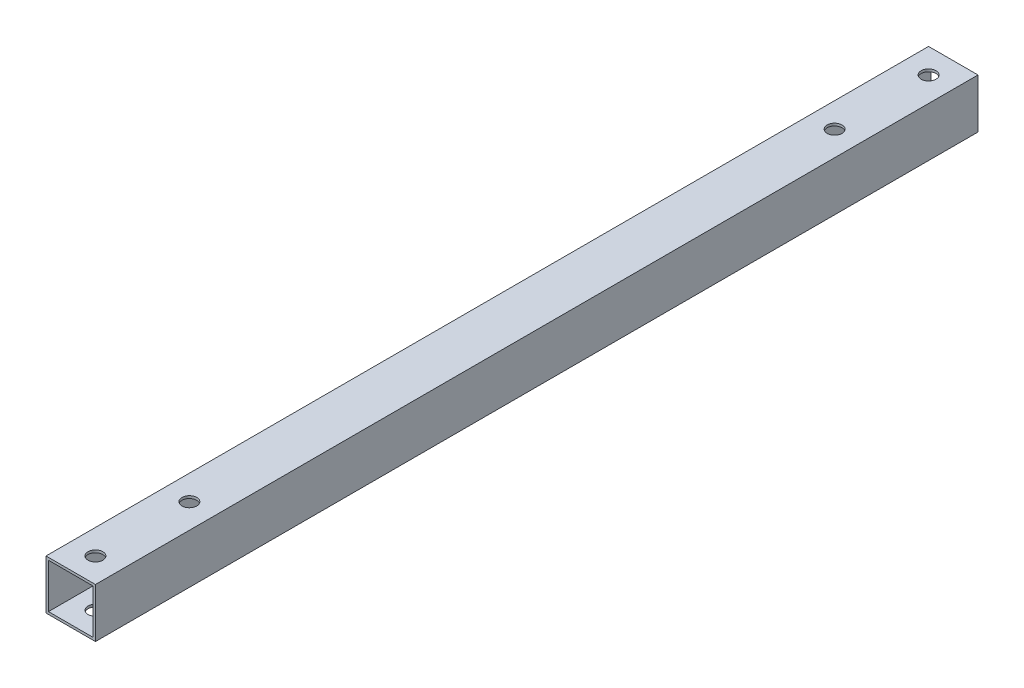
ISO-10303-21;
HEADER;
FILE_DESCRIPTION(('STEP AP214'),'2;1');
FILE_NAME('part.step','',(''),(''),'','','');
FILE_SCHEMA(('AUTOMOTIVE_DESIGN { 1 0 10303 214 1 1 1 1 }'));
ENDSEC;
DATA;
#1=APPLICATION_CONTEXT('core data for automotive mechanical design processes');
#2=APPLICATION_PROTOCOL_DEFINITION('international standard','automotive_design',2000,#1);
#3=PRODUCT_CONTEXT('',#1,'mechanical');
#4=PRODUCT('Part','Part','',(#3));
#5=PRODUCT_RELATED_PRODUCT_CATEGORY('part','',(#4));
#6=PRODUCT_DEFINITION_FORMATION('','',#4);
#7=PRODUCT_DEFINITION_CONTEXT('part definition',#1,'design');
#8=PRODUCT_DEFINITION('design','',#6,#7);
#9=PRODUCT_DEFINITION_SHAPE('','',#8);
#10=(LENGTH_UNIT() NAMED_UNIT(*) SI_UNIT(.MILLI.,.METRE.));
#11=(NAMED_UNIT(*) PLANE_ANGLE_UNIT() SI_UNIT($,.RADIAN.));
#12=(NAMED_UNIT(*) SI_UNIT($,.STERADIAN.) SOLID_ANGLE_UNIT());
#13=UNCERTAINTY_MEASURE_WITH_UNIT(LENGTH_MEASURE(1.E-05),#10,'distance_accuracy_value','');
#14=(GEOMETRIC_REPRESENTATION_CONTEXT(3) GLOBAL_UNCERTAINTY_ASSIGNED_CONTEXT((#13)) GLOBAL_UNIT_ASSIGNED_CONTEXT((#10,
#11,#12)) REPRESENTATION_CONTEXT('',''));
#15=CARTESIAN_POINT('',(0.,0.,0.));
#16=DIRECTION('',(0.,0.,1.));
#17=DIRECTION('',(1.,0.,0.));
#18=AXIS2_PLACEMENT_3D('',#15,#16,#17);
#19=CARTESIAN_POINT('',(5.,-5.,178.5));
#20=DIRECTION('',(0.,0.,1.));
#21=DIRECTION('',(1.,0.,0.));
#22=AXIS2_PLACEMENT_3D('',#19,#20,#21);
#23=PLANE('',#22);
#24=DIRECTION('',(0.,1.,0.));
#25=VECTOR('',#24,1.);
#26=CARTESIAN_POINT('',(5.,5.,178.5));
#27=LINE('',#26,#25);
#28=CARTESIAN_POINT('',(5.,-5.,178.5));
#29=VERTEX_POINT('',#28);
#30=CARTESIAN_POINT('',(5.,5.,178.5));
#31=VERTEX_POINT('',#30);
#32=EDGE_CURVE('E137',#29,#31,#27,.T.);
#33=ORIENTED_EDGE('',*,*,#32,.T.);
#34=DIRECTION('',(-1.,0.,0.));
#35=VECTOR('',#34,1.);
#36=CARTESIAN_POINT('',(-5.,5.,178.5));
#37=LINE('',#36,#35);
#38=CARTESIAN_POINT('',(-5.,5.,178.5));
#39=VERTEX_POINT('',#38);
#40=EDGE_CURVE('E140',#31,#39,#37,.T.);
#41=ORIENTED_EDGE('',*,*,#40,.T.);
#42=DIRECTION('',(0.,-1.,0.));
#43=VECTOR('',#42,1.);
#44=CARTESIAN_POINT('',(-5.,5.,178.5));
#45=LINE('',#44,#43);
#46=CARTESIAN_POINT('',(-5.,-5.,178.5));
#47=VERTEX_POINT('',#46);
#48=EDGE_CURVE('E143',#39,#47,#45,.T.);
#49=ORIENTED_EDGE('',*,*,#48,.T.);
#50=DIRECTION('',(1.,0.,0.));
#51=VECTOR('',#50,1.);
#52=CARTESIAN_POINT('',(-5.,-5.,178.5));
#53=LINE('',#52,#51);
#54=EDGE_CURVE('E145',#47,#29,#53,.T.);
#55=ORIENTED_EDGE('',*,*,#54,.T.);
#56=EDGE_LOOP('',(#33,#41,#49,#55));
#57=FACE_BOUND('',#56,.T.);
#58=DIRECTION('',(-1.,0.,0.));
#59=VECTOR('',#58,1.);
#60=CARTESIAN_POINT('',(-4.5,4.5,178.5));
#61=LINE('',#60,#59);
#62=CARTESIAN_POINT('',(4.5,4.5,178.5));
#63=VERTEX_POINT('',#62);
#64=CARTESIAN_POINT('',(-4.5,4.5,178.5));
#65=VERTEX_POINT('',#64);
#66=EDGE_CURVE('E107',#63,#65,#61,.T.);
#67=ORIENTED_EDGE('',*,*,#66,.F.);
#68=DIRECTION('',(0.,1.,0.));
#69=VECTOR('',#68,1.);
#70=CARTESIAN_POINT('',(4.5,4.5,178.5));
#71=LINE('',#70,#69);
#72=CARTESIAN_POINT('',(4.5,-4.5,178.5));
#73=VERTEX_POINT('',#72);
#74=EDGE_CURVE('E99',#73,#63,#71,.T.);
#75=ORIENTED_EDGE('',*,*,#74,.F.);
#76=DIRECTION('',(1.,0.,0.));
#77=VECTOR('',#76,1.);
#78=CARTESIAN_POINT('',(-4.5,-4.5,178.5));
#79=LINE('',#78,#77);
#80=CARTESIAN_POINT('',(-4.5,-4.5,178.5));
#81=VERTEX_POINT('',#80);
#82=EDGE_CURVE('E121',#81,#73,#79,.T.);
#83=ORIENTED_EDGE('',*,*,#82,.F.);
#84=DIRECTION('',(0.,-1.,0.));
#85=VECTOR('',#84,1.);
#86=CARTESIAN_POINT('',(-4.5,4.5,178.5));
#87=LINE('',#86,#85);
#88=EDGE_CURVE('E119',#65,#81,#87,.T.);
#89=ORIENTED_EDGE('',*,*,#88,.F.);
#90=EDGE_LOOP('',(#67,#75,#83,#89));
#91=FACE_BOUND('',#90,.T.);
#92=ADVANCED_FACE('F32',(#57,#91),#23,.T.);
#93=CARTESIAN_POINT('',(5.,-5.,0.));
#94=DIRECTION('',(0.,0.,1.));
#95=DIRECTION('',(1.,0.,0.));
#96=AXIS2_PLACEMENT_3D('',#93,#94,#95);
#97=PLANE('',#96);
#98=DIRECTION('',(0.,1.,0.));
#99=VECTOR('',#98,1.);
#100=CARTESIAN_POINT('',(5.,5.,0.));
#101=LINE('',#100,#99);
#102=CARTESIAN_POINT('',(5.,-5.,0.));
#103=VERTEX_POINT('',#102);
#104=CARTESIAN_POINT('',(5.,5.,0.));
#105=VERTEX_POINT('',#104);
#106=EDGE_CURVE('E115',#103,#105,#101,.T.);
#107=ORIENTED_EDGE('',*,*,#106,.F.);
#108=DIRECTION('',(1.,0.,0.));
#109=VECTOR('',#108,1.);
#110=CARTESIAN_POINT('',(-5.,-5.,0.));
#111=LINE('',#110,#109);
#112=CARTESIAN_POINT('',(-5.,-5.,0.));
#113=VERTEX_POINT('',#112);
#114=EDGE_CURVE('E141',#113,#103,#111,.T.);
#115=ORIENTED_EDGE('',*,*,#114,.F.);
#116=DIRECTION('',(0.,-1.,0.));
#117=VECTOR('',#116,1.);
#118=CARTESIAN_POINT('',(-5.,5.,0.));
#119=LINE('',#118,#117);
#120=CARTESIAN_POINT('',(-5.,5.,0.));
#121=VERTEX_POINT('',#120);
#122=EDGE_CURVE('E152',#121,#113,#119,.T.);
#123=ORIENTED_EDGE('',*,*,#122,.F.);
#124=DIRECTION('',(-1.,0.,0.));
#125=VECTOR('',#124,1.);
#126=CARTESIAN_POINT('',(-5.,5.,0.));
#127=LINE('',#126,#125);
#128=EDGE_CURVE('E150',#105,#121,#127,.T.);
#129=ORIENTED_EDGE('',*,*,#128,.F.);
#130=EDGE_LOOP('',(#107,#115,#123,#129));
#131=FACE_BOUND('',#130,.T.);
#132=DIRECTION('',(0.,1.,0.));
#133=VECTOR('',#132,1.);
#134=CARTESIAN_POINT('',(4.5,4.5,0.));
#135=LINE('',#134,#133);
#136=CARTESIAN_POINT('',(4.5,-4.5,0.));
#137=VERTEX_POINT('',#136);
#138=CARTESIAN_POINT('',(4.5,4.5,0.));
#139=VERTEX_POINT('',#138);
#140=EDGE_CURVE('E57',#137,#139,#135,.T.);
#141=ORIENTED_EDGE('',*,*,#140,.T.);
#142=DIRECTION('',(-1.,0.,0.));
#143=VECTOR('',#142,1.);
#144=CARTESIAN_POINT('',(-4.5,4.5,0.));
#145=LINE('',#144,#143);
#146=CARTESIAN_POINT('',(-4.5,4.5,0.));
#147=VERTEX_POINT('',#146);
#148=EDGE_CURVE('E114',#139,#147,#145,.T.);
#149=ORIENTED_EDGE('',*,*,#148,.T.);
#150=DIRECTION('',(0.,-1.,0.));
#151=VECTOR('',#150,1.);
#152=CARTESIAN_POINT('',(-4.5,4.5,0.));
#153=LINE('',#152,#151);
#154=CARTESIAN_POINT('',(-4.5,-4.5,0.));
#155=VERTEX_POINT('',#154);
#156=EDGE_CURVE('E129',#147,#155,#153,.T.);
#157=ORIENTED_EDGE('',*,*,#156,.T.);
#158=DIRECTION('',(1.,0.,0.));
#159=VECTOR('',#158,1.);
#160=CARTESIAN_POINT('',(-4.5,-4.5,0.));
#161=LINE('',#160,#159);
#162=EDGE_CURVE('E108',#155,#137,#161,.T.);
#163=ORIENTED_EDGE('',*,*,#162,.T.);
#164=EDGE_LOOP('',(#141,#149,#157,#163));
#165=FACE_BOUND('',#164,.T.);
#166=ADVANCED_FACE('F222',(#131,#165),#97,.F.);
#167=CARTESIAN_POINT('',(5.,5.,178.5));
#168=DIRECTION('',(-1.,0.,0.));
#169=DIRECTION('',(0.,-1.,0.));
#170=AXIS2_PLACEMENT_3D('',#167,#168,#169);
#171=PLANE('',#170);
#172=ORIENTED_EDGE('',*,*,#106,.T.);
#173=DIRECTION('',(0.,0.,-1.));
#174=VECTOR('',#173,1.);
#175=CARTESIAN_POINT('',(5.,5.,178.5));
#176=LINE('',#175,#174);
#177=EDGE_CURVE('E11',#31,#105,#176,.T.);
#178=ORIENTED_EDGE('',*,*,#177,.F.);
#179=ORIENTED_EDGE('',*,*,#32,.F.);
#180=DIRECTION('',(0.,0.,-1.));
#181=VECTOR('',#180,1.);
#182=CARTESIAN_POINT('',(5.,-5.,178.5));
#183=LINE('',#182,#181);
#184=EDGE_CURVE('E147',#29,#103,#183,.T.);
#185=ORIENTED_EDGE('',*,*,#184,.T.);
#186=EDGE_LOOP('',(#172,#178,#179,#185));
#187=FACE_BOUND('',#186,.T.);
#188=ADVANCED_FACE('F34',(#187),#171,.F.);
#189=CARTESIAN_POINT('',(-5.,5.,178.5));
#190=DIRECTION('',(0.,-1.,0.));
#191=DIRECTION('',(0.,0.,-1.));
#192=AXIS2_PLACEMENT_3D('',#189,#190,#191);
#193=PLANE('',#192);
#194=CARTESIAN_POINT('',(0.,5.,173.5));
#195=DIRECTION('',(0.,1.,0.));
#196=DIRECTION('',(0.,0.,1.));
#197=AXIS2_PLACEMENT_3D('',#194,#195,#196);
#198=CIRCLE('',#197,1.5);
#199=CARTESIAN_POINT('',(0.,5.,175.));
#200=VERTEX_POINT('',#199);
#201=EDGE_CURVE('E247',#200,#200,#198,.T.);
#202=ORIENTED_EDGE('',*,*,#201,.F.);
#203=EDGE_LOOP('',(#202));
#204=FACE_BOUND('',#203,.T.);
#205=CARTESIAN_POINT('',(0.,5.,154.5));
#206=DIRECTION('',(0.,1.,0.));
#207=DIRECTION('',(0.,0.,1.));
#208=AXIS2_PLACEMENT_3D('',#205,#206,#207);
#209=CIRCLE('',#208,1.5);
#210=CARTESIAN_POINT('',(0.,5.,156.));
#211=VERTEX_POINT('',#210);
#212=EDGE_CURVE('E180',#211,#211,#209,.T.);
#213=ORIENTED_EDGE('',*,*,#212,.F.);
#214=EDGE_LOOP('',(#213));
#215=FACE_BOUND('',#214,.T.);
#216=CARTESIAN_POINT('',(0.,5.,24.));
#217=DIRECTION('',(0.,1.,0.));
#218=DIRECTION('',(0.,0.,1.));
#219=AXIS2_PLACEMENT_3D('',#216,#217,#218);
#220=CIRCLE('',#219,1.5);
#221=CARTESIAN_POINT('',(0.,5.,25.5));
#222=VERTEX_POINT('',#221);
#223=EDGE_CURVE('E177',#222,#222,#220,.T.);
#224=ORIENTED_EDGE('',*,*,#223,.F.);
#225=EDGE_LOOP('',(#224));
#226=FACE_BOUND('',#225,.T.);
#227=CARTESIAN_POINT('',(0.,5.,5.));
#228=DIRECTION('',(0.,1.,0.));
#229=DIRECTION('',(0.,0.,1.));
#230=AXIS2_PLACEMENT_3D('',#227,#228,#229);
#231=CIRCLE('',#230,1.5);
#232=CARTESIAN_POINT('',(0.,5.,6.5));
#233=VERTEX_POINT('',#232);
#234=EDGE_CURVE('E196',#233,#233,#231,.T.);
#235=ORIENTED_EDGE('',*,*,#234,.F.);
#236=EDGE_LOOP('',(#235));
#237=FACE_BOUND('',#236,.T.);
#238=ORIENTED_EDGE('',*,*,#128,.T.);
#239=DIRECTION('',(0.,0.,-1.));
#240=VECTOR('',#239,1.);
#241=CARTESIAN_POINT('',(-5.,5.,178.5));
#242=LINE('',#241,#240);
#243=EDGE_CURVE('E41',#39,#121,#242,.T.);
#244=ORIENTED_EDGE('',*,*,#243,.F.);
#245=ORIENTED_EDGE('',*,*,#40,.F.);
#246=ORIENTED_EDGE('',*,*,#177,.T.);
#247=EDGE_LOOP('',(#238,#244,#245,#246));
#248=FACE_BOUND('',#247,.T.);
#249=ADVANCED_FACE('F236',(#204,#215,#226,#237,#248),#193,.F.);
#250=CARTESIAN_POINT('',(-5.,5.,178.5));
#251=DIRECTION('',(1.,0.,0.));
#252=DIRECTION('',(0.,1.,0.));
#253=AXIS2_PLACEMENT_3D('',#250,#251,#252);
#254=PLANE('',#253);
#255=ORIENTED_EDGE('',*,*,#122,.T.);
#256=DIRECTION('',(0.,0.,-1.));
#257=VECTOR('',#256,1.);
#258=CARTESIAN_POINT('',(-5.,-5.,178.5));
#259=LINE('',#258,#257);
#260=EDGE_CURVE('E157',#47,#113,#259,.T.);
#261=ORIENTED_EDGE('',*,*,#260,.F.);
#262=ORIENTED_EDGE('',*,*,#48,.F.);
#263=ORIENTED_EDGE('',*,*,#243,.T.);
#264=EDGE_LOOP('',(#255,#261,#262,#263));
#265=FACE_BOUND('',#264,.T.);
#266=ADVANCED_FACE('F233',(#265),#254,.F.);
#267=CARTESIAN_POINT('',(-5.,-5.,178.5));
#268=DIRECTION('',(0.,1.,0.));
#269=DIRECTION('',(-1.,0.,0.));
#270=AXIS2_PLACEMENT_3D('',#267,#268,#269);
#271=PLANE('',#270);
#272=CARTESIAN_POINT('',(0.,-5.,173.5));
#273=DIRECTION('',(0.,1.,0.));
#274=DIRECTION('',(0.,0.,1.));
#275=AXIS2_PLACEMENT_3D('',#272,#273,#274);
#276=CIRCLE('',#275,1.5);
#277=CARTESIAN_POINT('',(0.,-5.,175.));
#278=VERTEX_POINT('',#277);
#279=EDGE_CURVE('E302',#278,#278,#276,.T.);
#280=ORIENTED_EDGE('',*,*,#279,.T.);
#281=EDGE_LOOP('',(#280));
#282=FACE_BOUND('',#281,.T.);
#283=CARTESIAN_POINT('',(0.,-5.,154.5));
#284=DIRECTION('',(0.,1.,0.));
#285=DIRECTION('',(0.,0.,1.));
#286=AXIS2_PLACEMENT_3D('',#283,#284,#285);
#287=CIRCLE('',#286,1.5);
#288=CARTESIAN_POINT('',(0.,-5.,156.));
#289=VERTEX_POINT('',#288);
#290=EDGE_CURVE('E173',#289,#289,#287,.T.);
#291=ORIENTED_EDGE('',*,*,#290,.T.);
#292=EDGE_LOOP('',(#291));
#293=FACE_BOUND('',#292,.T.);
#294=CARTESIAN_POINT('',(0.,-5.,24.));
#295=DIRECTION('',(0.,1.,0.));
#296=DIRECTION('',(0.,0.,1.));
#297=AXIS2_PLACEMENT_3D('',#294,#295,#296);
#298=CIRCLE('',#297,1.5);
#299=CARTESIAN_POINT('',(0.,-5.,25.5));
#300=VERTEX_POINT('',#299);
#301=EDGE_CURVE('E169',#300,#300,#298,.T.);
#302=ORIENTED_EDGE('',*,*,#301,.T.);
#303=EDGE_LOOP('',(#302));
#304=FACE_BOUND('',#303,.T.);
#305=CARTESIAN_POINT('',(0.,-5.,5.));
#306=DIRECTION('',(0.,1.,0.));
#307=DIRECTION('',(0.,0.,1.));
#308=AXIS2_PLACEMENT_3D('',#305,#306,#307);
#309=CIRCLE('',#308,1.5);
#310=CARTESIAN_POINT('',(0.,-5.,6.5));
#311=VERTEX_POINT('',#310);
#312=EDGE_CURVE('E165',#311,#311,#309,.T.);
#313=ORIENTED_EDGE('',*,*,#312,.T.);
#314=EDGE_LOOP('',(#313));
#315=FACE_BOUND('',#314,.T.);
#316=ORIENTED_EDGE('',*,*,#114,.T.);
#317=ORIENTED_EDGE('',*,*,#184,.F.);
#318=ORIENTED_EDGE('',*,*,#54,.F.);
#319=ORIENTED_EDGE('',*,*,#260,.T.);
#320=EDGE_LOOP('',(#316,#317,#318,#319));
#321=FACE_BOUND('',#320,.T.);
#322=ADVANCED_FACE('F217',(#282,#293,#304,#315,#321),#271,.F.);
#323=CARTESIAN_POINT('',(4.5,4.5,178.5));
#324=DIRECTION('',(-1.,0.,0.));
#325=DIRECTION('',(0.,0.,1.));
#326=AXIS2_PLACEMENT_3D('',#323,#324,#325);
#327=PLANE('',#326);
#328=ORIENTED_EDGE('',*,*,#140,.F.);
#329=DIRECTION('',(0.,0.,-1.));
#330=VECTOR('',#329,1.);
#331=CARTESIAN_POINT('',(4.5,-4.5,178.5));
#332=LINE('',#331,#330);
#333=EDGE_CURVE('E103',#73,#137,#332,.T.);
#334=ORIENTED_EDGE('',*,*,#333,.F.);
#335=ORIENTED_EDGE('',*,*,#74,.T.);
#336=DIRECTION('',(0.,0.,-1.));
#337=VECTOR('',#336,1.);
#338=CARTESIAN_POINT('',(4.5,4.5,178.5));
#339=LINE('',#338,#337);
#340=EDGE_CURVE('E102',#63,#139,#339,.T.);
#341=ORIENTED_EDGE('',*,*,#340,.T.);
#342=EDGE_LOOP('',(#328,#334,#335,#341));
#343=FACE_BOUND('',#342,.T.);
#344=ADVANCED_FACE('F101',(#343),#327,.T.);
#345=CARTESIAN_POINT('',(-4.5,4.5,178.5));
#346=DIRECTION('',(0.,-1.,0.));
#347=DIRECTION('',(0.,0.,-1.));
#348=AXIS2_PLACEMENT_3D('',#345,#346,#347);
#349=PLANE('',#348);
#350=CARTESIAN_POINT('',(0.,4.5,173.5));
#351=DIRECTION('',(0.,-1.,0.));
#352=DIRECTION('',(0.,0.,-1.));
#353=AXIS2_PLACEMENT_3D('',#350,#351,#352);
#354=CIRCLE('',#353,1.5);
#355=CARTESIAN_POINT('',(0.,4.5,172.));
#356=VERTEX_POINT('',#355);
#357=EDGE_CURVE('E185',#356,#356,#354,.T.);
#358=ORIENTED_EDGE('',*,*,#357,.F.);
#359=EDGE_LOOP('',(#358));
#360=FACE_BOUND('',#359,.T.);
#361=CARTESIAN_POINT('',(0.,4.5,154.5));
#362=DIRECTION('',(0.,-1.,0.));
#363=DIRECTION('',(0.,0.,-1.));
#364=AXIS2_PLACEMENT_3D('',#361,#362,#363);
#365=CIRCLE('',#364,1.5);
#366=CARTESIAN_POINT('',(0.,4.5,153.));
#367=VERTEX_POINT('',#366);
#368=EDGE_CURVE('E172',#367,#367,#365,.T.);
#369=ORIENTED_EDGE('',*,*,#368,.F.);
#370=EDGE_LOOP('',(#369));
#371=FACE_BOUND('',#370,.T.);
#372=CARTESIAN_POINT('',(0.,4.5,24.));
#373=DIRECTION('',(0.,-1.,0.));
#374=DIRECTION('',(0.,0.,-1.));
#375=AXIS2_PLACEMENT_3D('',#372,#373,#374);
#376=CIRCLE('',#375,1.5);
#377=CARTESIAN_POINT('',(0.,4.5,22.5));
#378=VERTEX_POINT('',#377);
#379=EDGE_CURVE('E168',#378,#378,#376,.T.);
#380=ORIENTED_EDGE('',*,*,#379,.F.);
#381=EDGE_LOOP('',(#380));
#382=FACE_BOUND('',#381,.T.);
#383=CARTESIAN_POINT('',(0.,4.5,5.));
#384=DIRECTION('',(0.,-1.,0.));
#385=DIRECTION('',(0.,0.,-1.));
#386=AXIS2_PLACEMENT_3D('',#383,#384,#385);
#387=CIRCLE('',#386,1.5);
#388=CARTESIAN_POINT('',(0.,4.5,3.5));
#389=VERTEX_POINT('',#388);
#390=EDGE_CURVE('E127',#389,#389,#387,.T.);
#391=ORIENTED_EDGE('',*,*,#390,.F.);
#392=EDGE_LOOP('',(#391));
#393=FACE_BOUND('',#392,.T.);
#394=ORIENTED_EDGE('',*,*,#148,.F.);
#395=ORIENTED_EDGE('',*,*,#340,.F.);
#396=ORIENTED_EDGE('',*,*,#66,.T.);
#397=DIRECTION('',(0.,0.,-1.));
#398=VECTOR('',#397,1.);
#399=CARTESIAN_POINT('',(-4.5,4.5,178.5));
#400=LINE('',#399,#398);
#401=EDGE_CURVE('E116',#65,#147,#400,.T.);
#402=ORIENTED_EDGE('',*,*,#401,.T.);
#403=EDGE_LOOP('',(#394,#395,#396,#402));
#404=FACE_BOUND('',#403,.T.);
#405=ADVANCED_FACE('F111',(#360,#371,#382,#393,#404),#349,.T.);
#406=CARTESIAN_POINT('',(-4.5,4.5,178.5));
#407=DIRECTION('',(1.,0.,0.));
#408=DIRECTION('',(0.,0.,-1.));
#409=AXIS2_PLACEMENT_3D('',#406,#407,#408);
#410=PLANE('',#409);
#411=ORIENTED_EDGE('',*,*,#156,.F.);
#412=ORIENTED_EDGE('',*,*,#401,.F.);
#413=ORIENTED_EDGE('',*,*,#88,.T.);
#414=DIRECTION('',(0.,0.,-1.));
#415=VECTOR('',#414,1.);
#416=CARTESIAN_POINT('',(-4.5,-4.5,178.5));
#417=LINE('',#416,#415);
#418=EDGE_CURVE('E49',#81,#155,#417,.T.);
#419=ORIENTED_EDGE('',*,*,#418,.T.);
#420=EDGE_LOOP('',(#411,#412,#413,#419));
#421=FACE_BOUND('',#420,.T.);
#422=ADVANCED_FACE('F207',(#421),#410,.T.);
#423=CARTESIAN_POINT('',(-4.5,-4.5,178.5));
#424=DIRECTION('',(0.,1.,0.));
#425=DIRECTION('',(0.,0.,1.));
#426=AXIS2_PLACEMENT_3D('',#423,#424,#425);
#427=PLANE('',#426);
#428=CARTESIAN_POINT('',(0.,-4.5,173.5));
#429=DIRECTION('',(0.,1.,0.));
#430=DIRECTION('',(0.,0.,1.));
#431=AXIS2_PLACEMENT_3D('',#428,#429,#430);
#432=CIRCLE('',#431,1.5);
#433=CARTESIAN_POINT('',(0.,-4.5,175.));
#434=VERTEX_POINT('',#433);
#435=EDGE_CURVE('E36',#434,#434,#432,.T.);
#436=ORIENTED_EDGE('',*,*,#435,.F.);
#437=EDGE_LOOP('',(#436));
#438=FACE_BOUND('',#437,.T.);
#439=CARTESIAN_POINT('',(0.,-4.5,154.5));
#440=DIRECTION('',(0.,1.,0.));
#441=DIRECTION('',(0.,0.,1.));
#442=AXIS2_PLACEMENT_3D('',#439,#440,#441);
#443=CIRCLE('',#442,1.5);
#444=CARTESIAN_POINT('',(0.,-4.5,156.));
#445=VERTEX_POINT('',#444);
#446=EDGE_CURVE('E170',#445,#445,#443,.T.);
#447=ORIENTED_EDGE('',*,*,#446,.F.);
#448=EDGE_LOOP('',(#447));
#449=FACE_BOUND('',#448,.T.);
#450=CARTESIAN_POINT('',(0.,-4.5,24.));
#451=DIRECTION('',(0.,1.,0.));
#452=DIRECTION('',(0.,0.,1.));
#453=AXIS2_PLACEMENT_3D('',#450,#451,#452);
#454=CIRCLE('',#453,1.5);
#455=CARTESIAN_POINT('',(0.,-4.5,25.5));
#456=VERTEX_POINT('',#455);
#457=EDGE_CURVE('E166',#456,#456,#454,.T.);
#458=ORIENTED_EDGE('',*,*,#457,.F.);
#459=EDGE_LOOP('',(#458));
#460=FACE_BOUND('',#459,.T.);
#461=CARTESIAN_POINT('',(0.,-4.5,5.));
#462=DIRECTION('',(0.,1.,0.));
#463=DIRECTION('',(0.,0.,1.));
#464=AXIS2_PLACEMENT_3D('',#461,#462,#463);
#465=CIRCLE('',#464,1.5);
#466=CARTESIAN_POINT('',(0.,-4.5,6.5));
#467=VERTEX_POINT('',#466);
#468=EDGE_CURVE('E162',#467,#467,#465,.T.);
#469=ORIENTED_EDGE('',*,*,#468,.F.);
#470=EDGE_LOOP('',(#469));
#471=FACE_BOUND('',#470,.T.);
#472=ORIENTED_EDGE('',*,*,#162,.F.);
#473=ORIENTED_EDGE('',*,*,#418,.F.);
#474=ORIENTED_EDGE('',*,*,#82,.T.);
#475=ORIENTED_EDGE('',*,*,#333,.T.);
#476=EDGE_LOOP('',(#472,#473,#474,#475));
#477=FACE_BOUND('',#476,.T.);
#478=ADVANCED_FACE('F214',(#438,#449,#460,#471,#477),#427,.T.);
#479=CARTESIAN_POINT('',(0.,-5.,5.));
#480=DIRECTION('',(0.,1.,0.));
#481=DIRECTION('',(0.,0.,1.));
#482=AXIS2_PLACEMENT_3D('',#479,#480,#481);
#483=CYLINDRICAL_SURFACE('',#482,1.5);
#484=ORIENTED_EDGE('',*,*,#468,.T.);
#485=EDGE_LOOP('',(#484));
#486=FACE_BOUND('',#485,.T.);
#487=ORIENTED_EDGE('',*,*,#312,.F.);
#488=EDGE_LOOP('',(#487));
#489=FACE_BOUND('',#488,.T.);
#490=ADVANCED_FACE('F268',(#486,#489),#483,.F.);
#491=ORIENTED_EDGE('',*,*,#390,.T.);
#492=EDGE_LOOP('',(#491));
#493=FACE_BOUND('',#492,.T.);
#494=ORIENTED_EDGE('',*,*,#234,.T.);
#495=EDGE_LOOP('',(#494));
#496=FACE_BOUND('',#495,.T.);
#497=ADVANCED_FACE('F203',(#493,#496),#483,.F.);
#498=CARTESIAN_POINT('',(0.,-5.,24.));
#499=DIRECTION('',(0.,1.,0.));
#500=DIRECTION('',(0.,0.,1.));
#501=AXIS2_PLACEMENT_3D('',#498,#499,#500);
#502=CYLINDRICAL_SURFACE('',#501,1.5);
#503=ORIENTED_EDGE('',*,*,#457,.T.);
#504=EDGE_LOOP('',(#503));
#505=FACE_BOUND('',#504,.T.);
#506=ORIENTED_EDGE('',*,*,#301,.F.);
#507=EDGE_LOOP('',(#506));
#508=FACE_BOUND('',#507,.T.);
#509=ADVANCED_FACE('F279',(#505,#508),#502,.F.);
#510=ORIENTED_EDGE('',*,*,#379,.T.);
#511=EDGE_LOOP('',(#510));
#512=FACE_BOUND('',#511,.T.);
#513=ORIENTED_EDGE('',*,*,#223,.T.);
#514=EDGE_LOOP('',(#513));
#515=FACE_BOUND('',#514,.T.);
#516=ADVANCED_FACE('F282',(#512,#515),#502,.F.);
#517=CARTESIAN_POINT('',(0.,-5.,154.5));
#518=DIRECTION('',(0.,1.,0.));
#519=DIRECTION('',(0.,0.,1.));
#520=AXIS2_PLACEMENT_3D('',#517,#518,#519);
#521=CYLINDRICAL_SURFACE('',#520,1.5);
#522=ORIENTED_EDGE('',*,*,#446,.T.);
#523=EDGE_LOOP('',(#522));
#524=FACE_BOUND('',#523,.T.);
#525=ORIENTED_EDGE('',*,*,#290,.F.);
#526=EDGE_LOOP('',(#525));
#527=FACE_BOUND('',#526,.T.);
#528=ADVANCED_FACE('F284',(#524,#527),#521,.F.);
#529=ORIENTED_EDGE('',*,*,#368,.T.);
#530=EDGE_LOOP('',(#529));
#531=FACE_BOUND('',#530,.T.);
#532=ORIENTED_EDGE('',*,*,#212,.T.);
#533=EDGE_LOOP('',(#532));
#534=FACE_BOUND('',#533,.T.);
#535=ADVANCED_FACE('F287',(#531,#534),#521,.F.);
#536=CARTESIAN_POINT('',(0.,-5.,173.5));
#537=DIRECTION('',(0.,1.,0.));
#538=DIRECTION('',(0.,0.,1.));
#539=AXIS2_PLACEMENT_3D('',#536,#537,#538);
#540=CYLINDRICAL_SURFACE('',#539,1.5);
#541=ORIENTED_EDGE('',*,*,#435,.T.);
#542=EDGE_LOOP('',(#541));
#543=FACE_BOUND('',#542,.T.);
#544=ORIENTED_EDGE('',*,*,#279,.F.);
#545=EDGE_LOOP('',(#544));
#546=FACE_BOUND('',#545,.T.);
#547=ADVANCED_FACE('F288',(#543,#546),#540,.F.);
#548=ORIENTED_EDGE('',*,*,#357,.T.);
#549=EDGE_LOOP('',(#548));
#550=FACE_BOUND('',#549,.T.);
#551=ORIENTED_EDGE('',*,*,#201,.T.);
#552=EDGE_LOOP('',(#551));
#553=FACE_BOUND('',#552,.T.);
#554=ADVANCED_FACE('F290',(#550,#553),#540,.F.);
#555=CLOSED_SHELL('',(#92,#166,#188,#249,#266,#322,#344,#405,#422,#478,#490,#497,#509,#516,#528,
#535,#547,#554));
#556=MANIFOLD_SOLID_BREP('B2',#555);
#557=ADVANCED_BREP_SHAPE_REPRESENTATION('',(#18,#556),#14);
#558=SHAPE_DEFINITION_REPRESENTATION(#9,#557);
ENDSEC;
END-ISO-10303-21;
